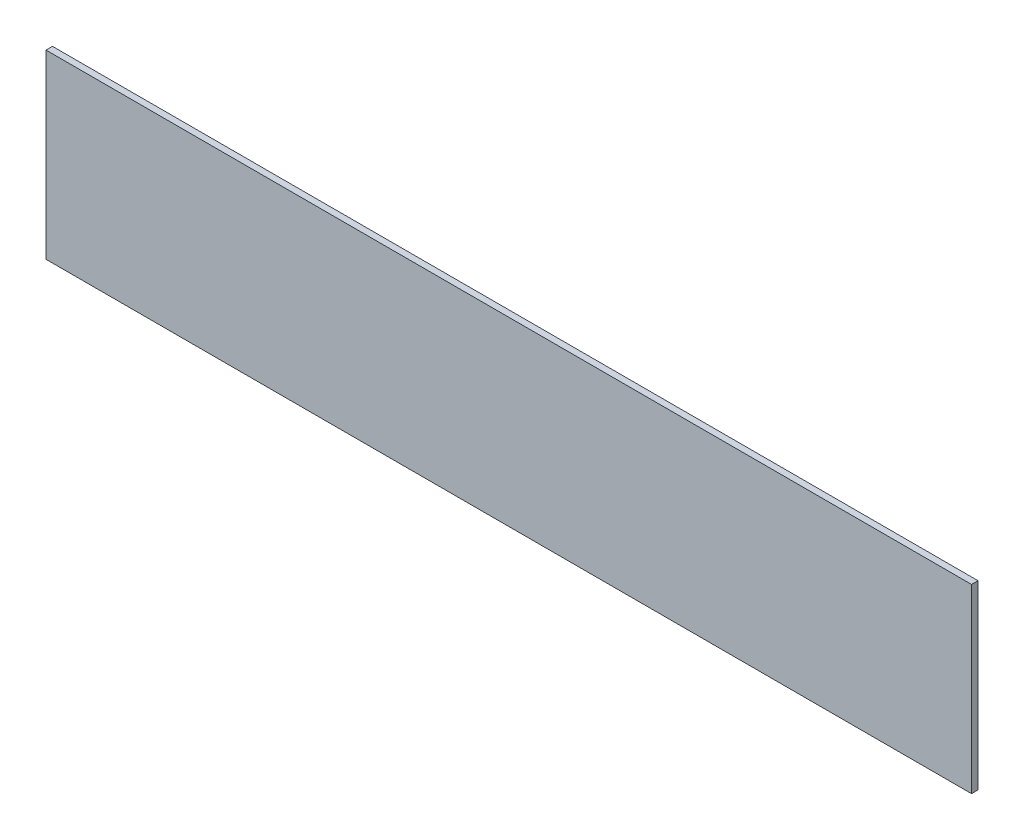
ISO-10303-21;
HEADER;
FILE_DESCRIPTION(('STEP AP214'),'2;1');
FILE_NAME('part.step','',(''),(''),'','','');
FILE_SCHEMA(('AUTOMOTIVE_DESIGN { 1 0 10303 214 1 1 1 1 }'));
ENDSEC;
DATA;
#1=APPLICATION_CONTEXT('core data for automotive mechanical design processes');
#2=APPLICATION_PROTOCOL_DEFINITION('international standard','automotive_design',2000,#1);
#3=PRODUCT_CONTEXT('',#1,'mechanical');
#4=PRODUCT('Part','Part','',(#3));
#5=PRODUCT_RELATED_PRODUCT_CATEGORY('part','',(#4));
#6=PRODUCT_DEFINITION_FORMATION('','',#4);
#7=PRODUCT_DEFINITION_CONTEXT('part definition',#1,'design');
#8=PRODUCT_DEFINITION('design','',#6,#7);
#9=PRODUCT_DEFINITION_SHAPE('','',#8);
#10=(LENGTH_UNIT() NAMED_UNIT(*) SI_UNIT(.MILLI.,.METRE.));
#11=(NAMED_UNIT(*) PLANE_ANGLE_UNIT() SI_UNIT($,.RADIAN.));
#12=(NAMED_UNIT(*) SI_UNIT($,.STERADIAN.) SOLID_ANGLE_UNIT());
#13=UNCERTAINTY_MEASURE_WITH_UNIT(LENGTH_MEASURE(1.E-05),#10,'distance_accuracy_value','');
#14=(GEOMETRIC_REPRESENTATION_CONTEXT(3) GLOBAL_UNCERTAINTY_ASSIGNED_CONTEXT((#13)) GLOBAL_UNIT_ASSIGNED_CONTEXT((#10,
#11,#12)) REPRESENTATION_CONTEXT('',''));
#15=CARTESIAN_POINT('',(0.,0.,0.));
#16=DIRECTION('',(0.,0.,1.));
#17=DIRECTION('',(1.,0.,0.));
#18=AXIS2_PLACEMENT_3D('',#15,#16,#17);
#19=CARTESIAN_POINT('',(227.0125,-44.45,1.5875));
#20=DIRECTION('',(-1.,0.,0.));
#21=DIRECTION('',(0.,0.,1.));
#22=AXIS2_PLACEMENT_3D('',#19,#20,#21);
#23=PLANE('',#22);
#24=DIRECTION('',(0.,1.,0.));
#25=VECTOR('',#24,1.);
#26=CARTESIAN_POINT('',(227.0125,-44.45,-1.5875));
#27=LINE('',#26,#25);
#28=CARTESIAN_POINT('',(227.0125,-44.45,-1.5875));
#29=VERTEX_POINT('',#28);
#30=CARTESIAN_POINT('',(227.0125,44.45,-1.5875));
#31=VERTEX_POINT('',#30);
#32=EDGE_CURVE('E97',#29,#31,#27,.T.);
#33=ORIENTED_EDGE('',*,*,#32,.T.);
#34=DIRECTION('',(0.,0.,-1.));
#35=VECTOR('',#34,1.);
#36=CARTESIAN_POINT('',(227.0125,44.45,1.5875));
#37=LINE('',#36,#35);
#38=CARTESIAN_POINT('',(227.0125,44.45,1.5875));
#39=VERTEX_POINT('',#38);
#40=EDGE_CURVE('E11',#39,#31,#37,.T.);
#41=ORIENTED_EDGE('',*,*,#40,.F.);
#42=DIRECTION('',(0.,1.,0.));
#43=VECTOR('',#42,1.);
#44=CARTESIAN_POINT('',(227.0125,-44.45,1.5875));
#45=LINE('',#44,#43);
#46=CARTESIAN_POINT('',(227.0125,-44.45,1.5875));
#47=VERTEX_POINT('',#46);
#48=EDGE_CURVE('E85',#47,#39,#45,.T.);
#49=ORIENTED_EDGE('',*,*,#48,.F.);
#50=DIRECTION('',(0.,0.,-1.));
#51=VECTOR('',#50,1.);
#52=CARTESIAN_POINT('',(227.0125,-44.45,1.5875));
#53=LINE('',#52,#51);
#54=EDGE_CURVE('E93',#47,#29,#53,.T.);
#55=ORIENTED_EDGE('',*,*,#54,.T.);
#56=EDGE_LOOP('',(#33,#41,#49,#55));
#57=FACE_BOUND('',#56,.T.);
#58=ADVANCED_FACE('F34',(#57),#23,.F.);
#59=CARTESIAN_POINT('',(-227.0125,44.45,1.5875));
#60=DIRECTION('',(0.,-1.,0.));
#61=DIRECTION('',(0.,0.,-1.));
#62=AXIS2_PLACEMENT_3D('',#59,#60,#61);
#63=PLANE('',#62);
#64=DIRECTION('',(-1.,0.,0.));
#65=VECTOR('',#64,1.);
#66=CARTESIAN_POINT('',(-227.0125,44.45,-1.5875));
#67=LINE('',#66,#65);
#68=CARTESIAN_POINT('',(-227.0125,44.45,-1.5875));
#69=VERTEX_POINT('',#68);
#70=EDGE_CURVE('E89',#31,#69,#67,.T.);
#71=ORIENTED_EDGE('',*,*,#70,.T.);
#72=DIRECTION('',(0.,0.,-1.));
#73=VECTOR('',#72,1.);
#74=CARTESIAN_POINT('',(-227.0125,44.45,1.5875));
#75=LINE('',#74,#73);
#76=CARTESIAN_POINT('',(-227.0125,44.45,1.5875));
#77=VERTEX_POINT('',#76);
#78=EDGE_CURVE('E42',#77,#69,#75,.T.);
#79=ORIENTED_EDGE('',*,*,#78,.F.);
#80=DIRECTION('',(-1.,0.,0.));
#81=VECTOR('',#80,1.);
#82=CARTESIAN_POINT('',(-227.0125,44.45,1.5875));
#83=LINE('',#82,#81);
#84=EDGE_CURVE('E80',#39,#77,#83,.T.);
#85=ORIENTED_EDGE('',*,*,#84,.F.);
#86=ORIENTED_EDGE('',*,*,#40,.T.);
#87=EDGE_LOOP('',(#71,#79,#85,#86));
#88=FACE_BOUND('',#87,.T.);
#89=ADVANCED_FACE('F88',(#88),#63,.F.);
#90=CARTESIAN_POINT('',(-227.0125,-44.45,1.5875));
#91=DIRECTION('',(1.,0.,0.));
#92=DIRECTION('',(0.,0.,-1.));
#93=AXIS2_PLACEMENT_3D('',#90,#91,#92);
#94=PLANE('',#93);
#95=DIRECTION('',(0.,-1.,0.));
#96=VECTOR('',#95,1.);
#97=CARTESIAN_POINT('',(-227.0125,-44.45,-1.5875));
#98=LINE('',#97,#96);
#99=CARTESIAN_POINT('',(-227.0125,-44.45,-1.5875));
#100=VERTEX_POINT('',#99);
#101=EDGE_CURVE('E67',#69,#100,#98,.T.);
#102=ORIENTED_EDGE('',*,*,#101,.T.);
#103=DIRECTION('',(0.,0.,-1.));
#104=VECTOR('',#103,1.);
#105=CARTESIAN_POINT('',(-227.0125,-44.45,1.5875));
#106=LINE('',#105,#104);
#107=CARTESIAN_POINT('',(-227.0125,-44.45,1.5875));
#108=VERTEX_POINT('',#107);
#109=EDGE_CURVE('E90',#108,#100,#106,.T.);
#110=ORIENTED_EDGE('',*,*,#109,.F.);
#111=DIRECTION('',(0.,-1.,0.));
#112=VECTOR('',#111,1.);
#113=CARTESIAN_POINT('',(-227.0125,-44.45,1.5875));
#114=LINE('',#113,#112);
#115=EDGE_CURVE('E83',#77,#108,#114,.T.);
#116=ORIENTED_EDGE('',*,*,#115,.F.);
#117=ORIENTED_EDGE('',*,*,#78,.T.);
#118=EDGE_LOOP('',(#102,#110,#116,#117));
#119=FACE_BOUND('',#118,.T.);
#120=ADVANCED_FACE('F91',(#119),#94,.F.);
#121=CARTESIAN_POINT('',(-227.0125,-44.45,1.5875));
#122=DIRECTION('',(0.,1.,0.));
#123=DIRECTION('',(0.,0.,1.));
#124=AXIS2_PLACEMENT_3D('',#121,#122,#123);
#125=PLANE('',#124);
#126=DIRECTION('',(1.,0.,0.));
#127=VECTOR('',#126,1.);
#128=CARTESIAN_POINT('',(-227.0125,-44.45,-1.5875));
#129=LINE('',#128,#127);
#130=EDGE_CURVE('E73',#100,#29,#129,.T.);
#131=ORIENTED_EDGE('',*,*,#130,.T.);
#132=ORIENTED_EDGE('',*,*,#54,.F.);
#133=DIRECTION('',(1.,0.,0.));
#134=VECTOR('',#133,1.);
#135=CARTESIAN_POINT('',(-227.0125,-44.45,1.5875));
#136=LINE('',#135,#134);
#137=EDGE_CURVE('E50',#108,#47,#136,.T.);
#138=ORIENTED_EDGE('',*,*,#137,.F.);
#139=ORIENTED_EDGE('',*,*,#109,.T.);
#140=EDGE_LOOP('',(#131,#132,#138,#139));
#141=FACE_BOUND('',#140,.T.);
#142=ADVANCED_FACE('F104',(#141),#125,.F.);
#143=CARTESIAN_POINT('',(0.,0.,1.5875));
#144=DIRECTION('',(0.,0.,-1.));
#145=DIRECTION('',(-1.,0.,0.));
#146=AXIS2_PLACEMENT_3D('',#143,#144,#145);
#147=PLANE('',#146);
#148=ORIENTED_EDGE('',*,*,#48,.T.);
#149=ORIENTED_EDGE('',*,*,#84,.T.);
#150=ORIENTED_EDGE('',*,*,#115,.T.);
#151=ORIENTED_EDGE('',*,*,#137,.T.);
#152=EDGE_LOOP('',(#148,#149,#150,#151));
#153=FACE_BOUND('',#152,.T.);
#154=ADVANCED_FACE('F81',(#153),#147,.F.);
#155=CARTESIAN_POINT('',(0.,0.,-1.5875));
#156=DIRECTION('',(0.,0.,-1.));
#157=DIRECTION('',(-1.,0.,0.));
#158=AXIS2_PLACEMENT_3D('',#155,#156,#157);
#159=PLANE('',#158);
#160=ORIENTED_EDGE('',*,*,#32,.F.);
#161=ORIENTED_EDGE('',*,*,#130,.F.);
#162=ORIENTED_EDGE('',*,*,#101,.F.);
#163=ORIENTED_EDGE('',*,*,#70,.F.);
#164=EDGE_LOOP('',(#160,#161,#162,#163));
#165=FACE_BOUND('',#164,.T.);
#166=ADVANCED_FACE('F107',(#165),#159,.T.);
#167=CLOSED_SHELL('',(#58,#89,#120,#142,#154,#166));
#168=MANIFOLD_SOLID_BREP('B2',#167);
#169=ADVANCED_BREP_SHAPE_REPRESENTATION('',(#18,#168),#14);
#170=SHAPE_DEFINITION_REPRESENTATION(#9,#169);
ENDSEC;
END-ISO-10303-21;
